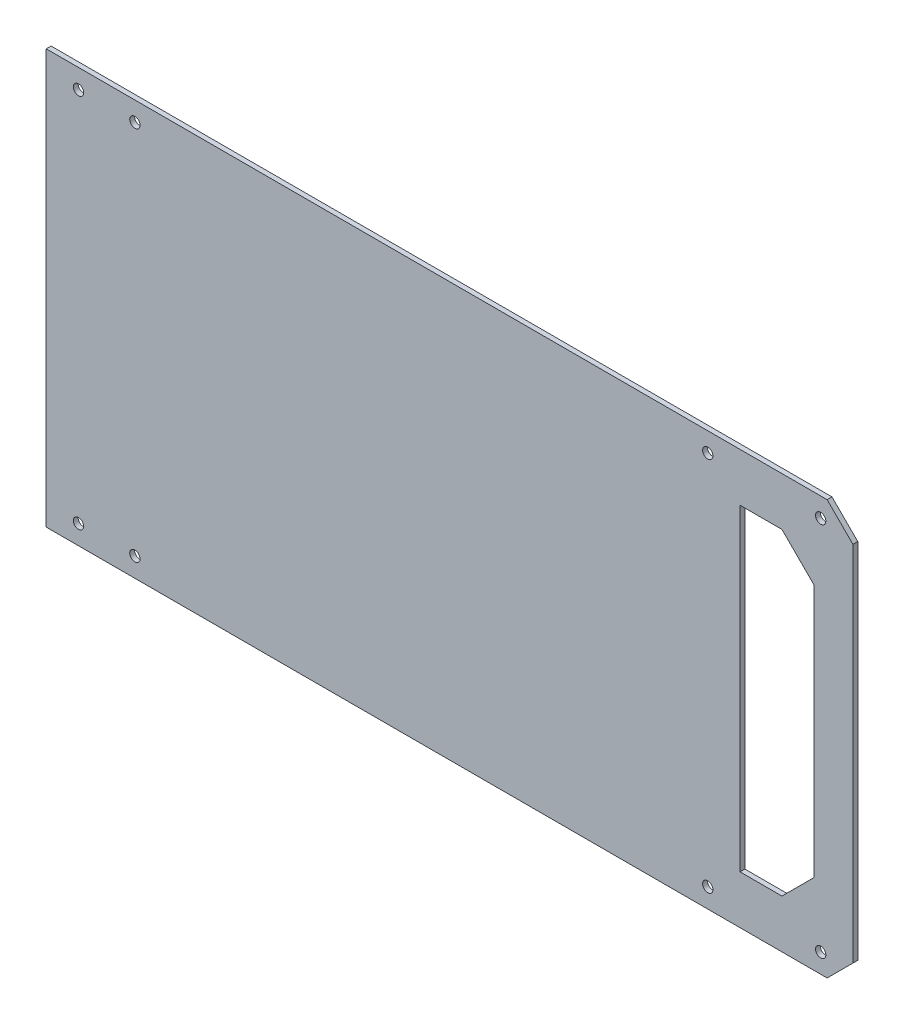
ISO-10303-21;
HEADER;
FILE_DESCRIPTION(('STEP AP214'),'2;1');
FILE_NAME('part.step','',(''),(''),'','','');
FILE_SCHEMA(('AUTOMOTIVE_DESIGN { 1 0 10303 214 1 1 1 1 }'));
ENDSEC;
DATA;
#1=APPLICATION_CONTEXT('core data for automotive mechanical design processes');
#2=APPLICATION_PROTOCOL_DEFINITION('international standard','automotive_design',2000,#1);
#3=PRODUCT_CONTEXT('',#1,'mechanical');
#4=PRODUCT('Part','Part','',(#3));
#5=PRODUCT_RELATED_PRODUCT_CATEGORY('part','',(#4));
#6=PRODUCT_DEFINITION_FORMATION('','',#4);
#7=PRODUCT_DEFINITION_CONTEXT('part definition',#1,'design');
#8=PRODUCT_DEFINITION('design','',#6,#7);
#9=PRODUCT_DEFINITION_SHAPE('','',#8);
#10=(LENGTH_UNIT() NAMED_UNIT(*) SI_UNIT(.MILLI.,.METRE.));
#11=(NAMED_UNIT(*) PLANE_ANGLE_UNIT() SI_UNIT($,.RADIAN.));
#12=(NAMED_UNIT(*) SI_UNIT($,.STERADIAN.) SOLID_ANGLE_UNIT());
#13=UNCERTAINTY_MEASURE_WITH_UNIT(LENGTH_MEASURE(1.E-05),#10,'distance_accuracy_value','');
#14=(GEOMETRIC_REPRESENTATION_CONTEXT(3) GLOBAL_UNCERTAINTY_ASSIGNED_CONTEXT((#13)) GLOBAL_UNIT_ASSIGNED_CONTEXT((#10,
#11,#12)) REPRESENTATION_CONTEXT('',''));
#15=CARTESIAN_POINT('',(0.,0.,0.));
#16=DIRECTION('',(0.,0.,1.));
#17=DIRECTION('',(1.,0.,0.));
#18=AXIS2_PLACEMENT_3D('',#15,#16,#17);
#19=CARTESIAN_POINT('',(0.,0.,1.5));
#20=DIRECTION('',(0.,0.,1.));
#21=DIRECTION('',(1.,0.,0.));
#22=AXIS2_PLACEMENT_3D('',#19,#20,#21);
#23=PLANE('',#22);
#24=CARTESIAN_POINT('',(-623.41400146484,111.91474286849,1.5));
#25=DIRECTION('',(0.,0.,1.));
#26=DIRECTION('',(1.,0.,0.));
#27=AXIS2_PLACEMENT_3D('',#24,#25,#26);
#28=CIRCLE('',#27,1.60000000000002);
#29=CARTESIAN_POINT('',(-621.81400146484,111.91474286849,1.5));
#30=VERTEX_POINT('',#29);
#31=EDGE_CURVE('E378',#30,#30,#28,.T.);
#32=ORIENTED_EDGE('',*,*,#31,.F.);
#33=EDGE_LOOP('',(#32));
#34=FACE_BOUND('',#33,.T.);
#35=CARTESIAN_POINT('',(-588.41400146484,-4.49999999999997,1.5));
#36=DIRECTION('',(0.,0.,1.));
#37=DIRECTION('',(1.,0.,0.));
#38=AXIS2_PLACEMENT_3D('',#35,#36,#37);
#39=CIRCLE('',#38,1.60000000000002);
#40=CARTESIAN_POINT('',(-586.81400146484,-4.49999999999997,1.5));
#41=VERTEX_POINT('',#40);
#42=EDGE_CURVE('E381',#41,#41,#39,.T.);
#43=ORIENTED_EDGE('',*,*,#42,.F.);
#44=EDGE_LOOP('',(#43));
#45=FACE_BOUND('',#44,.T.);
#46=CARTESIAN_POINT('',(-623.41400146484,-4.49999999999998,1.5));
#47=DIRECTION('',(0.,0.,1.));
#48=DIRECTION('',(1.,0.,0.));
#49=AXIS2_PLACEMENT_3D('',#46,#47,#48);
#50=CIRCLE('',#49,1.60000000000002);
#51=CARTESIAN_POINT('',(-621.81400146484,-4.49999999999998,1.5));
#52=VERTEX_POINT('',#51);
#53=EDGE_CURVE('E389',#52,#52,#50,.T.);
#54=ORIENTED_EDGE('',*,*,#53,.F.);
#55=EDGE_LOOP('',(#54));
#56=FACE_BOUND('',#55,.T.);
#57=CARTESIAN_POINT('',(-800.992483365761,-4.49999999999997,1.5));
#58=DIRECTION('',(0.,0.,1.));
#59=DIRECTION('',(1.,0.,0.));
#60=AXIS2_PLACEMENT_3D('',#57,#58,#59);
#61=CIRCLE('',#60,1.60000000000002);
#62=CARTESIAN_POINT('',(-799.392483365761,-4.49999999999997,1.5));
#63=VERTEX_POINT('',#62);
#64=EDGE_CURVE('E353',#63,#63,#61,.T.);
#65=ORIENTED_EDGE('',*,*,#64,.F.);
#66=EDGE_LOOP('',(#65));
#67=FACE_BOUND('',#66,.T.);
#68=CARTESIAN_POINT('',(-800.992483365761,111.91474286849,1.5));
#69=DIRECTION('',(0.,0.,1.));
#70=DIRECTION('',(1.,0.,0.));
#71=AXIS2_PLACEMENT_3D('',#68,#69,#70);
#72=CIRCLE('',#71,1.60000000000002);
#73=CARTESIAN_POINT('',(-799.392483365761,111.91474286849,1.5));
#74=VERTEX_POINT('',#73);
#75=EDGE_CURVE('E384',#74,#74,#72,.T.);
#76=ORIENTED_EDGE('',*,*,#75,.F.);
#77=EDGE_LOOP('',(#76));
#78=FACE_BOUND('',#77,.T.);
#79=CARTESIAN_POINT('',(-818.47776474,111.91474286849,1.5));
#80=DIRECTION('',(0.,0.,1.));
#81=DIRECTION('',(1.,0.,0.));
#82=AXIS2_PLACEMENT_3D('',#79,#80,#81);
#83=CIRCLE('',#82,1.60000000000002);
#84=CARTESIAN_POINT('',(-816.87776474,111.91474286849,1.5));
#85=VERTEX_POINT('',#84);
#86=EDGE_CURVE('E379',#85,#85,#83,.T.);
#87=ORIENTED_EDGE('',*,*,#86,.F.);
#88=EDGE_LOOP('',(#87));
#89=FACE_BOUND('',#88,.T.);
#90=CARTESIAN_POINT('',(-588.41400146484,111.91474286849,1.5));
#91=DIRECTION('',(0.,0.,1.));
#92=DIRECTION('',(1.,0.,0.));
#93=AXIS2_PLACEMENT_3D('',#90,#91,#92);
#94=CIRCLE('',#93,1.60000000000002);
#95=CARTESIAN_POINT('',(-586.81400146484,111.91474286849,1.5));
#96=VERTEX_POINT('',#95);
#97=EDGE_CURVE('E376',#96,#96,#94,.T.);
#98=ORIENTED_EDGE('',*,*,#97,.F.);
#99=EDGE_LOOP('',(#98));
#100=FACE_BOUND('',#99,.T.);
#101=CARTESIAN_POINT('',(-818.47776474,-4.49999999999997,1.5));
#102=DIRECTION('',(0.,0.,1.));
#103=DIRECTION('',(1.,0.,0.));
#104=AXIS2_PLACEMENT_3D('',#101,#102,#103);
#105=CIRCLE('',#104,1.60000000000002);
#106=CARTESIAN_POINT('',(-816.87776474,-4.49999999999997,1.5));
#107=VERTEX_POINT('',#106);
#108=EDGE_CURVE('E219',#107,#107,#105,.T.);
#109=ORIENTED_EDGE('',*,*,#108,.F.);
#110=EDGE_LOOP('',(#109));
#111=FACE_BOUND('',#110,.T.);
#112=DIRECTION('',(0.707106781186551,0.707106781186544,0.));
#113=VECTOR('',#112,1.);
#114=CARTESIAN_POINT('',(-586.41400146484,-10.5,1.5));
#115=LINE('',#114,#113);
#116=CARTESIAN_POINT('',(-586.41400146484,-10.5,1.5));
#117=VERTEX_POINT('',#116);
#118=CARTESIAN_POINT('',(-578.41400146484,-2.49999999999994,1.5));
#119=VERTEX_POINT('',#118);
#120=EDGE_CURVE('E176',#117,#119,#115,.T.);
#121=ORIENTED_EDGE('',*,*,#120,.T.);
#122=DIRECTION('',(0.,1.,0.));
#123=VECTOR('',#122,1.);
#124=CARTESIAN_POINT('',(-578.41400146484,-2.49999999999994,1.5));
#125=LINE('',#124,#123);
#126=CARTESIAN_POINT('',(-578.41400146484,109.91474286849,1.5));
#127=VERTEX_POINT('',#126);
#128=EDGE_CURVE('E179',#119,#127,#125,.T.);
#129=ORIENTED_EDGE('',*,*,#128,.T.);
#130=DIRECTION('',(-0.707106781186548,0.707106781186547,0.));
#131=VECTOR('',#130,1.);
#132=CARTESIAN_POINT('',(-578.41400146484,109.91474286849,1.5));
#133=LINE('',#132,#131);
#134=CARTESIAN_POINT('',(-586.41400146484,117.91474286849,1.5));
#135=VERTEX_POINT('',#134);
#136=EDGE_CURVE('E182',#127,#135,#133,.T.);
#137=ORIENTED_EDGE('',*,*,#136,.T.);
#138=DIRECTION('',(-1.,0.,0.));
#139=VECTOR('',#138,1.);
#140=CARTESIAN_POINT('',(-586.41400146484,117.91474286849,1.5));
#141=LINE('',#140,#139);
#142=CARTESIAN_POINT('',(-828.47776474,117.91474286849,1.5));
#143=VERTEX_POINT('',#142);
#144=EDGE_CURVE('E184',#135,#143,#141,.T.);
#145=ORIENTED_EDGE('',*,*,#144,.T.);
#146=DIRECTION('',(0.,-1.,0.));
#147=VECTOR('',#146,1.);
#148=CARTESIAN_POINT('',(-828.47776474,117.91474286849,1.5));
#149=LINE('',#148,#147);
#150=CARTESIAN_POINT('',(-828.47776474,-10.5,1.5));
#151=VERTEX_POINT('',#150);
#152=EDGE_CURVE('E186',#143,#151,#149,.T.);
#153=ORIENTED_EDGE('',*,*,#152,.T.);
#154=DIRECTION('',(1.,0.,0.));
#155=VECTOR('',#154,1.);
#156=CARTESIAN_POINT('',(-828.47776474,-10.5,1.5));
#157=LINE('',#156,#155);
#158=EDGE_CURVE('E188',#151,#117,#157,.T.);
#159=ORIENTED_EDGE('',*,*,#158,.T.);
#160=EDGE_LOOP('',(#121,#129,#137,#145,#153,#159));
#161=FACE_BOUND('',#160,.T.);
#162=DIRECTION('',(1.,0.,0.));
#163=VECTOR('',#162,1.);
#164=CARTESIAN_POINT('',(-613.41400146484,4.50000000000001,1.5));
#165=LINE('',#164,#163);
#166=CARTESIAN_POINT('',(-613.41400146484,4.50000000000001,1.5));
#167=VERTEX_POINT('',#166);
#168=CARTESIAN_POINT('',(-600.41400146484,4.50000000000001,1.5));
#169=VERTEX_POINT('',#168);
#170=EDGE_CURVE('E132',#167,#169,#165,.T.);
#171=ORIENTED_EDGE('',*,*,#170,.F.);
#172=DIRECTION('',(0.,-1.,0.));
#173=VECTOR('',#172,1.);
#174=CARTESIAN_POINT('',(-613.41400146484,102.91474286849,1.5));
#175=LINE('',#174,#173);
#176=CARTESIAN_POINT('',(-613.41400146484,102.91474286849,1.5));
#177=VERTEX_POINT('',#176);
#178=EDGE_CURVE('E124',#177,#167,#175,.T.);
#179=ORIENTED_EDGE('',*,*,#178,.F.);
#180=DIRECTION('',(-1.,0.,0.));
#181=VECTOR('',#180,1.);
#182=CARTESIAN_POINT('',(-600.41400146484,102.91474286849,1.5));
#183=LINE('',#182,#181);
#184=CARTESIAN_POINT('',(-600.41400146484,102.91474286849,1.5));
#185=VERTEX_POINT('',#184);
#186=EDGE_CURVE('E154',#185,#177,#183,.T.);
#187=ORIENTED_EDGE('',*,*,#186,.F.);
#188=DIRECTION('',(-0.707106781186548,0.707106781186547,0.));
#189=VECTOR('',#188,1.);
#190=CARTESIAN_POINT('',(-590.41400146484,92.91474286849,1.5));
#191=LINE('',#190,#189);
#192=CARTESIAN_POINT('',(-590.41400146484,92.91474286849,1.5));
#193=VERTEX_POINT('',#192);
#194=EDGE_CURVE('E152',#193,#185,#191,.T.);
#195=ORIENTED_EDGE('',*,*,#194,.F.);
#196=DIRECTION('',(0.,1.,0.));
#197=VECTOR('',#196,1.);
#198=CARTESIAN_POINT('',(-590.41400146484,14.5,1.5));
#199=LINE('',#198,#197);
#200=CARTESIAN_POINT('',(-590.41400146484,14.5,1.5));
#201=VERTEX_POINT('',#200);
#202=EDGE_CURVE('E147',#201,#193,#199,.T.);
#203=ORIENTED_EDGE('',*,*,#202,.F.);
#204=DIRECTION('',(0.707106781186548,0.707106781186547,0.));
#205=VECTOR('',#204,1.);
#206=CARTESIAN_POINT('',(-600.41400146484,4.50000000000001,1.5));
#207=LINE('',#206,#205);
#208=EDGE_CURVE('E145',#169,#201,#207,.T.);
#209=ORIENTED_EDGE('',*,*,#208,.F.);
#210=EDGE_LOOP('',(#171,#179,#187,#195,#203,#209));
#211=FACE_BOUND('',#210,.T.);
#212=ADVANCED_FACE('F33',(#34,#45,#56,#67,#78,#89,#100,#111,#161,#211),#23,.T.);
#213=CARTESIAN_POINT('',(0.,0.,0.));
#214=DIRECTION('',(0.,0.,1.));
#215=DIRECTION('',(1.,0.,0.));
#216=AXIS2_PLACEMENT_3D('',#213,#214,#215);
#217=PLANE('',#216);
#218=CARTESIAN_POINT('',(-623.41400146484,111.91474286849,0.));
#219=DIRECTION('',(0.,0.,1.));
#220=DIRECTION('',(1.,0.,0.));
#221=AXIS2_PLACEMENT_3D('',#218,#219,#220);
#222=CIRCLE('',#221,1.60000000000002);
#223=CARTESIAN_POINT('',(-621.81400146484,111.91474286849,0.));
#224=VERTEX_POINT('',#223);
#225=EDGE_CURVE('E37',#224,#224,#222,.T.);
#226=ORIENTED_EDGE('',*,*,#225,.T.);
#227=EDGE_LOOP('',(#226));
#228=FACE_BOUND('',#227,.T.);
#229=CARTESIAN_POINT('',(-588.41400146484,-4.49999999999997,0.));
#230=DIRECTION('',(0.,0.,1.));
#231=DIRECTION('',(1.,0.,0.));
#232=AXIS2_PLACEMENT_3D('',#229,#230,#231);
#233=CIRCLE('',#232,1.60000000000002);
#234=CARTESIAN_POINT('',(-586.81400146484,-4.49999999999997,0.));
#235=VERTEX_POINT('',#234);
#236=EDGE_CURVE('E233',#235,#235,#233,.T.);
#237=ORIENTED_EDGE('',*,*,#236,.T.);
#238=EDGE_LOOP('',(#237));
#239=FACE_BOUND('',#238,.T.);
#240=CARTESIAN_POINT('',(-623.41400146484,-4.49999999999998,0.));
#241=DIRECTION('',(0.,0.,1.));
#242=DIRECTION('',(1.,0.,0.));
#243=AXIS2_PLACEMENT_3D('',#240,#241,#242);
#244=CIRCLE('',#243,1.60000000000002);
#245=CARTESIAN_POINT('',(-621.81400146484,-4.49999999999998,0.));
#246=VERTEX_POINT('',#245);
#247=EDGE_CURVE('E231',#246,#246,#244,.T.);
#248=ORIENTED_EDGE('',*,*,#247,.T.);
#249=EDGE_LOOP('',(#248));
#250=FACE_BOUND('',#249,.T.);
#251=CARTESIAN_POINT('',(-800.992483365761,-4.49999999999997,0.));
#252=DIRECTION('',(0.,0.,1.));
#253=DIRECTION('',(1.,0.,0.));
#254=AXIS2_PLACEMENT_3D('',#251,#252,#253);
#255=CIRCLE('',#254,1.60000000000002);
#256=CARTESIAN_POINT('',(-799.392483365761,-4.49999999999997,0.));
#257=VERTEX_POINT('',#256);
#258=EDGE_CURVE('E228',#257,#257,#255,.T.);
#259=ORIENTED_EDGE('',*,*,#258,.T.);
#260=EDGE_LOOP('',(#259));
#261=FACE_BOUND('',#260,.T.);
#262=CARTESIAN_POINT('',(-800.992483365761,111.91474286849,0.));
#263=DIRECTION('',(0.,0.,1.));
#264=DIRECTION('',(1.,0.,0.));
#265=AXIS2_PLACEMENT_3D('',#262,#263,#264);
#266=CIRCLE('',#265,1.60000000000002);
#267=CARTESIAN_POINT('',(-799.392483365761,111.91474286849,0.));
#268=VERTEX_POINT('',#267);
#269=EDGE_CURVE('E225',#268,#268,#266,.T.);
#270=ORIENTED_EDGE('',*,*,#269,.T.);
#271=EDGE_LOOP('',(#270));
#272=FACE_BOUND('',#271,.T.);
#273=CARTESIAN_POINT('',(-818.47776474,111.91474286849,0.));
#274=DIRECTION('',(0.,0.,1.));
#275=DIRECTION('',(1.,0.,0.));
#276=AXIS2_PLACEMENT_3D('',#273,#274,#275);
#277=CIRCLE('',#276,1.60000000000002);
#278=CARTESIAN_POINT('',(-816.87776474,111.91474286849,0.));
#279=VERTEX_POINT('',#278);
#280=EDGE_CURVE('E222',#279,#279,#277,.T.);
#281=ORIENTED_EDGE('',*,*,#280,.T.);
#282=EDGE_LOOP('',(#281));
#283=FACE_BOUND('',#282,.T.);
#284=CARTESIAN_POINT('',(-588.41400146484,111.91474286849,0.));
#285=DIRECTION('',(0.,0.,1.));
#286=DIRECTION('',(1.,0.,0.));
#287=AXIS2_PLACEMENT_3D('',#284,#285,#286);
#288=CIRCLE('',#287,1.60000000000002);
#289=CARTESIAN_POINT('',(-586.81400146484,111.91474286849,0.));
#290=VERTEX_POINT('',#289);
#291=EDGE_CURVE('E218',#290,#290,#288,.T.);
#292=ORIENTED_EDGE('',*,*,#291,.T.);
#293=EDGE_LOOP('',(#292));
#294=FACE_BOUND('',#293,.T.);
#295=CARTESIAN_POINT('',(-818.47776474,-4.49999999999997,0.));
#296=DIRECTION('',(0.,0.,1.));
#297=DIRECTION('',(1.,0.,0.));
#298=AXIS2_PLACEMENT_3D('',#295,#296,#297);
#299=CIRCLE('',#298,1.60000000000002);
#300=CARTESIAN_POINT('',(-816.87776474,-4.49999999999997,0.));
#301=VERTEX_POINT('',#300);
#302=EDGE_CURVE('E215',#301,#301,#299,.T.);
#303=ORIENTED_EDGE('',*,*,#302,.T.);
#304=EDGE_LOOP('',(#303));
#305=FACE_BOUND('',#304,.T.);
#306=DIRECTION('',(0.707106781186551,0.707106781186544,0.));
#307=VECTOR('',#306,1.);
#308=CARTESIAN_POINT('',(-586.41400146484,-10.5,0.));
#309=LINE('',#308,#307);
#310=CARTESIAN_POINT('',(-586.41400146484,-10.5,0.));
#311=VERTEX_POINT('',#310);
#312=CARTESIAN_POINT('',(-578.41400146484,-2.49999999999994,0.));
#313=VERTEX_POINT('',#312);
#314=EDGE_CURVE('E140',#311,#313,#309,.T.);
#315=ORIENTED_EDGE('',*,*,#314,.F.);
#316=DIRECTION('',(1.,0.,0.));
#317=VECTOR('',#316,1.);
#318=CARTESIAN_POINT('',(-828.47776474,-10.5,0.));
#319=LINE('',#318,#317);
#320=CARTESIAN_POINT('',(-828.47776474,-10.5,0.));
#321=VERTEX_POINT('',#320);
#322=EDGE_CURVE('E180',#321,#311,#319,.T.);
#323=ORIENTED_EDGE('',*,*,#322,.F.);
#324=DIRECTION('',(0.,-1.,0.));
#325=VECTOR('',#324,1.);
#326=CARTESIAN_POINT('',(-828.47776474,117.91474286849,0.));
#327=LINE('',#326,#325);
#328=CARTESIAN_POINT('',(-828.47776474,117.91474286849,0.));
#329=VERTEX_POINT('',#328);
#330=EDGE_CURVE('E199',#329,#321,#327,.T.);
#331=ORIENTED_EDGE('',*,*,#330,.F.);
#332=DIRECTION('',(-1.,0.,0.));
#333=VECTOR('',#332,1.);
#334=CARTESIAN_POINT('',(-586.41400146484,117.91474286849,0.));
#335=LINE('',#334,#333);
#336=CARTESIAN_POINT('',(-586.41400146484,117.91474286849,0.));
#337=VERTEX_POINT('',#336);
#338=EDGE_CURVE('E197',#337,#329,#335,.T.);
#339=ORIENTED_EDGE('',*,*,#338,.F.);
#340=DIRECTION('',(-0.707106781186548,0.707106781186547,0.));
#341=VECTOR('',#340,1.);
#342=CARTESIAN_POINT('',(-578.41400146484,109.91474286849,0.));
#343=LINE('',#342,#341);
#344=CARTESIAN_POINT('',(-578.41400146484,109.91474286849,0.));
#345=VERTEX_POINT('',#344);
#346=EDGE_CURVE('E195',#345,#337,#343,.T.);
#347=ORIENTED_EDGE('',*,*,#346,.F.);
#348=DIRECTION('',(0.,1.,0.));
#349=VECTOR('',#348,1.);
#350=CARTESIAN_POINT('',(-578.41400146484,-2.49999999999994,0.));
#351=LINE('',#350,#349);
#352=EDGE_CURVE('E193',#313,#345,#351,.T.);
#353=ORIENTED_EDGE('',*,*,#352,.F.);
#354=EDGE_LOOP('',(#315,#323,#331,#339,#347,#353));
#355=FACE_BOUND('',#354,.T.);
#356=DIRECTION('',(0.,-1.,0.));
#357=VECTOR('',#356,1.);
#358=CARTESIAN_POINT('',(-613.41400146484,102.91474286849,0.));
#359=LINE('',#358,#357);
#360=CARTESIAN_POINT('',(-613.41400146484,102.91474286849,0.));
#361=VERTEX_POINT('',#360);
#362=CARTESIAN_POINT('',(-613.41400146484,4.50000000000001,0.));
#363=VERTEX_POINT('',#362);
#364=EDGE_CURVE('E58',#361,#363,#359,.T.);
#365=ORIENTED_EDGE('',*,*,#364,.T.);
#366=DIRECTION('',(1.,0.,0.));
#367=VECTOR('',#366,1.);
#368=CARTESIAN_POINT('',(-613.41400146484,4.50000000000001,0.));
#369=LINE('',#368,#367);
#370=CARTESIAN_POINT('',(-600.41400146484,4.50000000000001,0.));
#371=VERTEX_POINT('',#370);
#372=EDGE_CURVE('E139',#363,#371,#369,.T.);
#373=ORIENTED_EDGE('',*,*,#372,.T.);
#374=DIRECTION('',(0.707106781186548,0.707106781186547,0.));
#375=VECTOR('',#374,1.);
#376=CARTESIAN_POINT('',(-600.41400146484,4.50000000000001,0.));
#377=LINE('',#376,#375);
#378=CARTESIAN_POINT('',(-590.41400146484,14.5,0.));
#379=VERTEX_POINT('',#378);
#380=EDGE_CURVE('E158',#371,#379,#377,.T.);
#381=ORIENTED_EDGE('',*,*,#380,.T.);
#382=DIRECTION('',(0.,1.,0.));
#383=VECTOR('',#382,1.);
#384=CARTESIAN_POINT('',(-590.41400146484,14.5,0.));
#385=LINE('',#384,#383);
#386=CARTESIAN_POINT('',(-590.41400146484,92.91474286849,0.));
#387=VERTEX_POINT('',#386);
#388=EDGE_CURVE('E161',#379,#387,#385,.T.);
#389=ORIENTED_EDGE('',*,*,#388,.T.);
#390=DIRECTION('',(-0.707106781186548,0.707106781186547,0.));
#391=VECTOR('',#390,1.);
#392=CARTESIAN_POINT('',(-590.41400146484,92.91474286849,0.));
#393=LINE('',#392,#391);
#394=CARTESIAN_POINT('',(-600.41400146484,102.91474286849,0.));
#395=VERTEX_POINT('',#394);
#396=EDGE_CURVE('E164',#387,#395,#393,.T.);
#397=ORIENTED_EDGE('',*,*,#396,.T.);
#398=DIRECTION('',(-1.,0.,0.));
#399=VECTOR('',#398,1.);
#400=CARTESIAN_POINT('',(-600.41400146484,102.91474286849,0.));
#401=LINE('',#400,#399);
#402=EDGE_CURVE('E133',#395,#361,#401,.T.);
#403=ORIENTED_EDGE('',*,*,#402,.T.);
#404=EDGE_LOOP('',(#365,#373,#381,#389,#397,#403));
#405=FACE_BOUND('',#404,.T.);
#406=ADVANCED_FACE('F240',(#228,#239,#250,#261,#272,#283,#294,#305,#355,#405),#217,.F.);
#407=CARTESIAN_POINT('',(-586.41400146484,-10.5,1.5));
#408=DIRECTION('',(-0.707106781186544,0.70710678118655,0.));
#409=DIRECTION('',(-0.707106781186551,-0.707106781186545,0.));
#410=AXIS2_PLACEMENT_3D('',#407,#408,#409);
#411=PLANE('',#410);
#412=ORIENTED_EDGE('',*,*,#314,.T.);
#413=DIRECTION('',(0.,0.,-1.));
#414=VECTOR('',#413,1.);
#415=CARTESIAN_POINT('',(-578.41400146484,-2.49999999999994,1.5));
#416=LINE('',#415,#414);
#417=EDGE_CURVE('E11',#119,#313,#416,.T.);
#418=ORIENTED_EDGE('',*,*,#417,.F.);
#419=ORIENTED_EDGE('',*,*,#120,.F.);
#420=DIRECTION('',(0.,0.,-1.));
#421=VECTOR('',#420,1.);
#422=CARTESIAN_POINT('',(-586.41400146484,-10.5,1.5));
#423=LINE('',#422,#421);
#424=EDGE_CURVE('E190',#117,#311,#423,.T.);
#425=ORIENTED_EDGE('',*,*,#424,.T.);
#426=EDGE_LOOP('',(#412,#418,#419,#425));
#427=FACE_BOUND('',#426,.T.);
#428=ADVANCED_FACE('F35',(#427),#411,.F.);
#429=CARTESIAN_POINT('',(-578.41400146484,-2.49999999999994,1.5));
#430=DIRECTION('',(-1.,0.,0.));
#431=DIRECTION('',(0.,0.,1.));
#432=AXIS2_PLACEMENT_3D('',#429,#430,#431);
#433=PLANE('',#432);
#434=ORIENTED_EDGE('',*,*,#352,.T.);
#435=DIRECTION('',(0.,0.,-1.));
#436=VECTOR('',#435,1.);
#437=CARTESIAN_POINT('',(-578.41400146484,109.91474286849,1.5));
#438=LINE('',#437,#436);
#439=EDGE_CURVE('E42',#127,#345,#438,.T.);
#440=ORIENTED_EDGE('',*,*,#439,.F.);
#441=ORIENTED_EDGE('',*,*,#128,.F.);
#442=ORIENTED_EDGE('',*,*,#417,.T.);
#443=EDGE_LOOP('',(#434,#440,#441,#442));
#444=FACE_BOUND('',#443,.T.);
#445=ADVANCED_FACE('F281',(#444),#433,.F.);
#446=CARTESIAN_POINT('',(-578.41400146484,109.91474286849,1.5));
#447=DIRECTION('',(-0.707106781186547,-0.707106781186548,0.));
#448=DIRECTION('',(0.707106781186548,-0.707106781186547,0.));
#449=AXIS2_PLACEMENT_3D('',#446,#447,#448);
#450=PLANE('',#449);
#451=ORIENTED_EDGE('',*,*,#346,.T.);
#452=DIRECTION('',(0.,0.,-1.));
#453=VECTOR('',#452,1.);
#454=CARTESIAN_POINT('',(-586.41400146484,117.91474286849,1.5));
#455=LINE('',#454,#453);
#456=EDGE_CURVE('E210',#135,#337,#455,.T.);
#457=ORIENTED_EDGE('',*,*,#456,.F.);
#458=ORIENTED_EDGE('',*,*,#136,.F.);
#459=ORIENTED_EDGE('',*,*,#439,.T.);
#460=EDGE_LOOP('',(#451,#457,#458,#459));
#461=FACE_BOUND('',#460,.T.);
#462=ADVANCED_FACE('F278',(#461),#450,.F.);
#463=CARTESIAN_POINT('',(-586.41400146484,117.91474286849,1.5));
#464=DIRECTION('',(0.,-1.,0.));
#465=DIRECTION('',(0.,0.,-1.));
#466=AXIS2_PLACEMENT_3D('',#463,#464,#465);
#467=PLANE('',#466);
#468=ORIENTED_EDGE('',*,*,#338,.T.);
#469=DIRECTION('',(0.,0.,-1.));
#470=VECTOR('',#469,1.);
#471=CARTESIAN_POINT('',(-828.47776474,117.91474286849,1.5));
#472=LINE('',#471,#470);
#473=EDGE_CURVE('E207',#143,#329,#472,.T.);
#474=ORIENTED_EDGE('',*,*,#473,.F.);
#475=ORIENTED_EDGE('',*,*,#144,.F.);
#476=ORIENTED_EDGE('',*,*,#456,.T.);
#477=EDGE_LOOP('',(#468,#474,#475,#476));
#478=FACE_BOUND('',#477,.T.);
#479=ADVANCED_FACE('F274',(#478),#467,.F.);
#480=CARTESIAN_POINT('',(-828.47776474,117.91474286849,1.5));
#481=DIRECTION('',(1.,0.,0.));
#482=DIRECTION('',(0.,0.,-1.));
#483=AXIS2_PLACEMENT_3D('',#480,#481,#482);
#484=PLANE('',#483);
#485=ORIENTED_EDGE('',*,*,#330,.T.);
#486=DIRECTION('',(0.,0.,-1.));
#487=VECTOR('',#486,1.);
#488=CARTESIAN_POINT('',(-828.47776474,-10.5,1.5));
#489=LINE('',#488,#487);
#490=EDGE_CURVE('E204',#151,#321,#489,.T.);
#491=ORIENTED_EDGE('',*,*,#490,.F.);
#492=ORIENTED_EDGE('',*,*,#152,.F.);
#493=ORIENTED_EDGE('',*,*,#473,.T.);
#494=EDGE_LOOP('',(#485,#491,#492,#493));
#495=FACE_BOUND('',#494,.T.);
#496=ADVANCED_FACE('F270',(#495),#484,.F.);
#497=CARTESIAN_POINT('',(-828.47776474,-10.5,1.5));
#498=DIRECTION('',(0.,1.,0.));
#499=DIRECTION('',(0.,0.,1.));
#500=AXIS2_PLACEMENT_3D('',#497,#498,#499);
#501=PLANE('',#500);
#502=ORIENTED_EDGE('',*,*,#322,.T.);
#503=ORIENTED_EDGE('',*,*,#424,.F.);
#504=ORIENTED_EDGE('',*,*,#158,.F.);
#505=ORIENTED_EDGE('',*,*,#490,.T.);
#506=EDGE_LOOP('',(#502,#503,#504,#505));
#507=FACE_BOUND('',#506,.T.);
#508=ADVANCED_FACE('F267',(#507),#501,.F.);
#509=CARTESIAN_POINT('',(-613.41400146484,102.91474286849,1.5));
#510=DIRECTION('',(1.,0.,0.));
#511=DIRECTION('',(0.,0.,-1.));
#512=AXIS2_PLACEMENT_3D('',#509,#510,#511);
#513=PLANE('',#512);
#514=ORIENTED_EDGE('',*,*,#364,.F.);
#515=DIRECTION('',(0.,0.,-1.));
#516=VECTOR('',#515,1.);
#517=CARTESIAN_POINT('',(-613.41400146484,102.91474286849,1.5));
#518=LINE('',#517,#516);
#519=EDGE_CURVE('E128',#177,#361,#518,.T.);
#520=ORIENTED_EDGE('',*,*,#519,.F.);
#521=ORIENTED_EDGE('',*,*,#178,.T.);
#522=DIRECTION('',(0.,0.,-1.));
#523=VECTOR('',#522,1.);
#524=CARTESIAN_POINT('',(-613.41400146484,4.50000000000001,1.5));
#525=LINE('',#524,#523);
#526=EDGE_CURVE('E127',#167,#363,#525,.T.);
#527=ORIENTED_EDGE('',*,*,#526,.T.);
#528=EDGE_LOOP('',(#514,#520,#521,#527));
#529=FACE_BOUND('',#528,.T.);
#530=ADVANCED_FACE('F126',(#529),#513,.T.);
#531=CARTESIAN_POINT('',(-613.41400146484,4.50000000000001,1.5));
#532=DIRECTION('',(0.,1.,0.));
#533=DIRECTION('',(-1.,0.,0.));
#534=AXIS2_PLACEMENT_3D('',#531,#532,#533);
#535=PLANE('',#534);
#536=ORIENTED_EDGE('',*,*,#372,.F.);
#537=ORIENTED_EDGE('',*,*,#526,.F.);
#538=ORIENTED_EDGE('',*,*,#170,.T.);
#539=DIRECTION('',(0.,0.,-1.));
#540=VECTOR('',#539,1.);
#541=CARTESIAN_POINT('',(-600.41400146484,4.50000000000001,1.5));
#542=LINE('',#541,#540);
#543=EDGE_CURVE('E141',#169,#371,#542,.T.);
#544=ORIENTED_EDGE('',*,*,#543,.T.);
#545=EDGE_LOOP('',(#536,#537,#538,#544));
#546=FACE_BOUND('',#545,.T.);
#547=ADVANCED_FACE('F136',(#546),#535,.T.);
#548=CARTESIAN_POINT('',(-600.41400146484,4.50000000000001,1.5));
#549=DIRECTION('',(-0.707106781186547,0.707106781186548,0.));
#550=DIRECTION('',(-0.707106781186548,-0.707106781186547,0.));
#551=AXIS2_PLACEMENT_3D('',#548,#549,#550);
#552=PLANE('',#551);
#553=ORIENTED_EDGE('',*,*,#380,.F.);
#554=ORIENTED_EDGE('',*,*,#543,.F.);
#555=ORIENTED_EDGE('',*,*,#208,.T.);
#556=DIRECTION('',(0.,0.,-1.));
#557=VECTOR('',#556,1.);
#558=CARTESIAN_POINT('',(-590.41400146484,14.5,1.5));
#559=LINE('',#558,#557);
#560=EDGE_CURVE('E173',#201,#379,#559,.T.);
#561=ORIENTED_EDGE('',*,*,#560,.T.);
#562=EDGE_LOOP('',(#553,#554,#555,#561));
#563=FACE_BOUND('',#562,.T.);
#564=ADVANCED_FACE('F320',(#563),#552,.T.);
#565=CARTESIAN_POINT('',(-590.41400146484,14.5,1.5));
#566=DIRECTION('',(-1.,0.,0.));
#567=DIRECTION('',(0.,0.,1.));
#568=AXIS2_PLACEMENT_3D('',#565,#566,#567);
#569=PLANE('',#568);
#570=ORIENTED_EDGE('',*,*,#388,.F.);
#571=ORIENTED_EDGE('',*,*,#560,.F.);
#572=ORIENTED_EDGE('',*,*,#202,.T.);
#573=DIRECTION('',(0.,0.,-1.));
#574=VECTOR('',#573,1.);
#575=CARTESIAN_POINT('',(-590.41400146484,92.91474286849,1.5));
#576=LINE('',#575,#574);
#577=EDGE_CURVE('E171',#193,#387,#576,.T.);
#578=ORIENTED_EDGE('',*,*,#577,.T.);
#579=EDGE_LOOP('',(#570,#571,#572,#578));
#580=FACE_BOUND('',#579,.T.);
#581=ADVANCED_FACE('F316',(#580),#569,.T.);
#582=CARTESIAN_POINT('',(-590.41400146484,92.91474286849,1.5));
#583=DIRECTION('',(-0.707106781186547,-0.707106781186548,0.));
#584=DIRECTION('',(0.707106781186548,-0.707106781186547,0.));
#585=AXIS2_PLACEMENT_3D('',#582,#583,#584);
#586=PLANE('',#585);
#587=ORIENTED_EDGE('',*,*,#396,.F.);
#588=ORIENTED_EDGE('',*,*,#577,.F.);
#589=ORIENTED_EDGE('',*,*,#194,.T.);
#590=DIRECTION('',(0.,0.,-1.));
#591=VECTOR('',#590,1.);
#592=CARTESIAN_POINT('',(-600.41400146484,102.91474286849,1.5));
#593=LINE('',#592,#591);
#594=EDGE_CURVE('E50',#185,#395,#593,.T.);
#595=ORIENTED_EDGE('',*,*,#594,.T.);
#596=EDGE_LOOP('',(#587,#588,#589,#595));
#597=FACE_BOUND('',#596,.T.);
#598=ADVANCED_FACE('F313',(#597),#586,.T.);
#599=CARTESIAN_POINT('',(-600.41400146484,102.91474286849,1.5));
#600=DIRECTION('',(0.,-1.,0.));
#601=DIRECTION('',(0.,0.,-1.));
#602=AXIS2_PLACEMENT_3D('',#599,#600,#601);
#603=PLANE('',#602);
#604=ORIENTED_EDGE('',*,*,#402,.F.);
#605=ORIENTED_EDGE('',*,*,#594,.F.);
#606=ORIENTED_EDGE('',*,*,#186,.T.);
#607=ORIENTED_EDGE('',*,*,#519,.T.);
#608=EDGE_LOOP('',(#604,#605,#606,#607));
#609=FACE_BOUND('',#608,.T.);
#610=ADVANCED_FACE('F309',(#609),#603,.T.);
#611=CARTESIAN_POINT('',(-818.47776474,-4.49999999999997,-2.));
#612=DIRECTION('',(0.,0.,1.));
#613=DIRECTION('',(1.,0.,0.));
#614=AXIS2_PLACEMENT_3D('',#611,#612,#613);
#615=CYLINDRICAL_SURFACE('',#614,1.60000000000002);
#616=ORIENTED_EDGE('',*,*,#108,.T.);
#617=EDGE_LOOP('',(#616));
#618=FACE_BOUND('',#617,.T.);
#619=ORIENTED_EDGE('',*,*,#302,.F.);
#620=EDGE_LOOP('',(#619));
#621=FACE_BOUND('',#620,.T.);
#622=ADVANCED_FACE('F333',(#618,#621),#615,.F.);
#623=CARTESIAN_POINT('',(-588.41400146484,111.91474286849,-2.));
#624=DIRECTION('',(0.,0.,1.));
#625=DIRECTION('',(1.,0.,0.));
#626=AXIS2_PLACEMENT_3D('',#623,#624,#625);
#627=CYLINDRICAL_SURFACE('',#626,1.60000000000002);
#628=ORIENTED_EDGE('',*,*,#97,.T.);
#629=EDGE_LOOP('',(#628));
#630=FACE_BOUND('',#629,.T.);
#631=ORIENTED_EDGE('',*,*,#291,.F.);
#632=EDGE_LOOP('',(#631));
#633=FACE_BOUND('',#632,.T.);
#634=ADVANCED_FACE('F336',(#630,#633),#627,.F.);
#635=CARTESIAN_POINT('',(-818.47776474,111.91474286849,-2.));
#636=DIRECTION('',(0.,0.,1.));
#637=DIRECTION('',(1.,0.,0.));
#638=AXIS2_PLACEMENT_3D('',#635,#636,#637);
#639=CYLINDRICAL_SURFACE('',#638,1.60000000000002);
#640=ORIENTED_EDGE('',*,*,#86,.T.);
#641=EDGE_LOOP('',(#640));
#642=FACE_BOUND('',#641,.T.);
#643=ORIENTED_EDGE('',*,*,#280,.F.);
#644=EDGE_LOOP('',(#643));
#645=FACE_BOUND('',#644,.T.);
#646=ADVANCED_FACE('F347',(#642,#645),#639,.F.);
#647=CARTESIAN_POINT('',(-800.992483365761,111.91474286849,-2.));
#648=DIRECTION('',(0.,0.,1.));
#649=DIRECTION('',(1.,0.,0.));
#650=AXIS2_PLACEMENT_3D('',#647,#648,#649);
#651=CYLINDRICAL_SURFACE('',#650,1.60000000000002);
#652=ORIENTED_EDGE('',*,*,#75,.T.);
#653=EDGE_LOOP('',(#652));
#654=FACE_BOUND('',#653,.T.);
#655=ORIENTED_EDGE('',*,*,#269,.F.);
#656=EDGE_LOOP('',(#655));
#657=FACE_BOUND('',#656,.T.);
#658=ADVANCED_FACE('F342',(#654,#657),#651,.F.);
#659=CARTESIAN_POINT('',(-800.992483365761,-4.49999999999997,-2.));
#660=DIRECTION('',(0.,0.,1.));
#661=DIRECTION('',(1.,0.,0.));
#662=AXIS2_PLACEMENT_3D('',#659,#660,#661);
#663=CYLINDRICAL_SURFACE('',#662,1.60000000000002);
#664=ORIENTED_EDGE('',*,*,#64,.T.);
#665=EDGE_LOOP('',(#664));
#666=FACE_BOUND('',#665,.T.);
#667=ORIENTED_EDGE('',*,*,#258,.F.);
#668=EDGE_LOOP('',(#667));
#669=FACE_BOUND('',#668,.T.);
#670=ADVANCED_FACE('F339',(#666,#669),#663,.F.);
#671=CARTESIAN_POINT('',(-623.41400146484,-4.49999999999998,-2.));
#672=DIRECTION('',(0.,0.,1.));
#673=DIRECTION('',(1.,0.,0.));
#674=AXIS2_PLACEMENT_3D('',#671,#672,#673);
#675=CYLINDRICAL_SURFACE('',#674,1.60000000000002);
#676=ORIENTED_EDGE('',*,*,#53,.T.);
#677=EDGE_LOOP('',(#676));
#678=FACE_BOUND('',#677,.T.);
#679=ORIENTED_EDGE('',*,*,#247,.F.);
#680=EDGE_LOOP('',(#679));
#681=FACE_BOUND('',#680,.T.);
#682=ADVANCED_FACE('F250',(#678,#681),#675,.F.);
#683=CARTESIAN_POINT('',(-588.41400146484,-4.49999999999997,-2.));
#684=DIRECTION('',(0.,0.,1.));
#685=DIRECTION('',(1.,0.,0.));
#686=AXIS2_PLACEMENT_3D('',#683,#684,#685);
#687=CYLINDRICAL_SURFACE('',#686,1.60000000000002);
#688=ORIENTED_EDGE('',*,*,#42,.T.);
#689=EDGE_LOOP('',(#688));
#690=FACE_BOUND('',#689,.T.);
#691=ORIENTED_EDGE('',*,*,#236,.F.);
#692=EDGE_LOOP('',(#691));
#693=FACE_BOUND('',#692,.T.);
#694=ADVANCED_FACE('F244',(#690,#693),#687,.F.);
#695=CARTESIAN_POINT('',(-623.41400146484,111.91474286849,-2.));
#696=DIRECTION('',(0.,0.,1.));
#697=DIRECTION('',(1.,0.,0.));
#698=AXIS2_PLACEMENT_3D('',#695,#696,#697);
#699=CYLINDRICAL_SURFACE('',#698,1.60000000000002);
#700=ORIENTED_EDGE('',*,*,#31,.T.);
#701=EDGE_LOOP('',(#700));
#702=FACE_BOUND('',#701,.T.);
#703=ORIENTED_EDGE('',*,*,#225,.F.);
#704=EDGE_LOOP('',(#703));
#705=FACE_BOUND('',#704,.T.);
#706=ADVANCED_FACE('F242',(#702,#705),#699,.F.);
#707=CLOSED_SHELL('',(#212,#406,#428,#445,#462,#479,#496,#508,#530,#547,#564,#581,#598,#610,
#622,#634,#646,#658,#670,#682,#694,#706));
#708=MANIFOLD_SOLID_BREP('B2',#707);
#709=ADVANCED_BREP_SHAPE_REPRESENTATION('',(#18,#708),#14);
#710=SHAPE_DEFINITION_REPRESENTATION(#9,#709);
ENDSEC;
END-ISO-10303-21;
